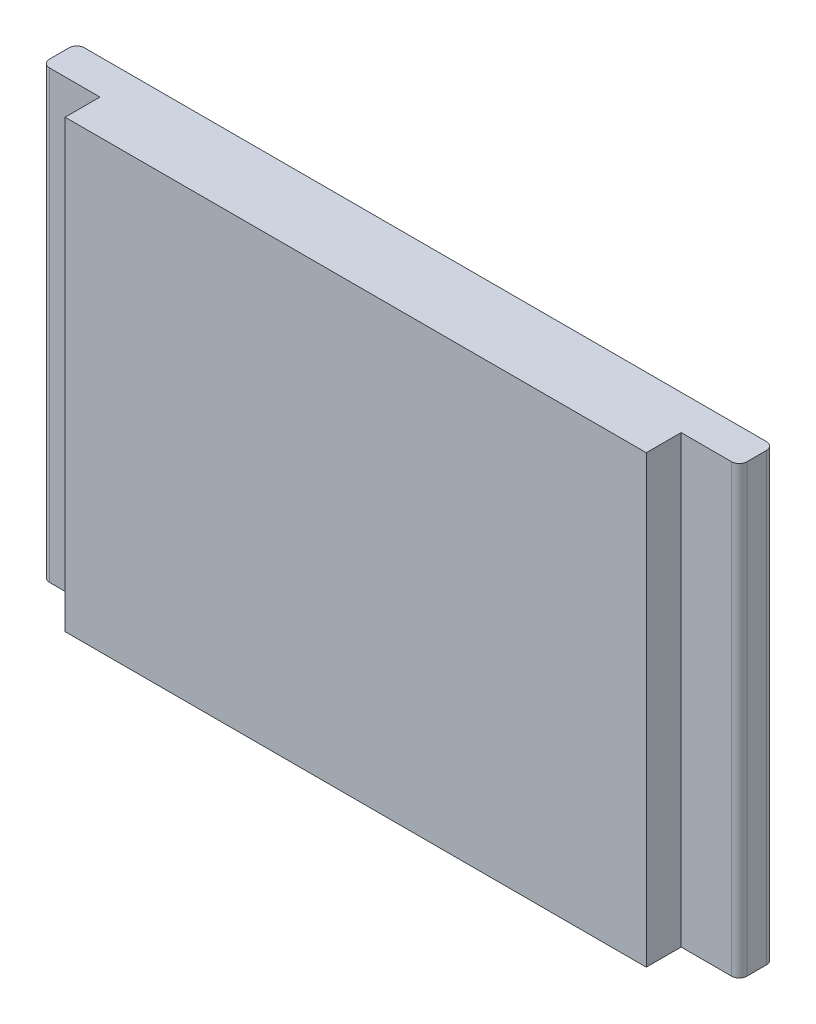
ISO-10303-21;
HEADER;
FILE_DESCRIPTION(('STEP AP214'),'2;1');
FILE_NAME('part.step','',(''),(''),'','','');
FILE_SCHEMA(('AUTOMOTIVE_DESIGN { 1 0 10303 214 1 1 1 1 }'));
ENDSEC;
DATA;
#1=APPLICATION_CONTEXT('core data for automotive mechanical design processes');
#2=APPLICATION_PROTOCOL_DEFINITION('international standard','automotive_design',2000,#1);
#3=PRODUCT_CONTEXT('',#1,'mechanical');
#4=PRODUCT('Part','Part','',(#3));
#5=PRODUCT_RELATED_PRODUCT_CATEGORY('part','',(#4));
#6=PRODUCT_DEFINITION_FORMATION('','',#4);
#7=PRODUCT_DEFINITION_CONTEXT('part definition',#1,'design');
#8=PRODUCT_DEFINITION('design','',#6,#7);
#9=PRODUCT_DEFINITION_SHAPE('','',#8);
#10=(LENGTH_UNIT() NAMED_UNIT(*) SI_UNIT(.MILLI.,.METRE.));
#11=(NAMED_UNIT(*) PLANE_ANGLE_UNIT() SI_UNIT($,.RADIAN.));
#12=(NAMED_UNIT(*) SI_UNIT($,.STERADIAN.) SOLID_ANGLE_UNIT());
#13=UNCERTAINTY_MEASURE_WITH_UNIT(LENGTH_MEASURE(1.E-05),#10,'distance_accuracy_value','');
#14=(GEOMETRIC_REPRESENTATION_CONTEXT(3) GLOBAL_UNCERTAINTY_ASSIGNED_CONTEXT((#13)) GLOBAL_UNIT_ASSIGNED_CONTEXT((#10,
#11,#12)) REPRESENTATION_CONTEXT('',''));
#15=CARTESIAN_POINT('',(0.,0.,0.));
#16=DIRECTION('',(0.,0.,1.));
#17=DIRECTION('',(1.,0.,0.));
#18=AXIS2_PLACEMENT_3D('',#15,#16,#17);
#19=CARTESIAN_POINT('',(-83.7886311209956,115.,-27.8081601870833));
#20=DIRECTION('',(1.,0.,0.));
#21=DIRECTION('',(0.,0.,-1.));
#22=AXIS2_PLACEMENT_3D('',#19,#20,#21);
#23=PLANE('',#22);
#24=DIRECTION('',(0.,0.,1.));
#25=VECTOR('',#24,1.);
#26=CARTESIAN_POINT('',(-83.7886311209956,0.,-27.8081601870833));
#27=LINE('',#26,#25);
#28=CARTESIAN_POINT('',(-83.7886311209956,0.,-27.8081601870833));
#29=VERTEX_POINT('',#28);
#30=CARTESIAN_POINT('',(-83.7886311209956,0.,-18.8081601870833));
#31=VERTEX_POINT('',#30);
#32=EDGE_CURVE('E179',#29,#31,#27,.T.);
#33=ORIENTED_EDGE('',*,*,#32,.T.);
#34=DIRECTION('',(0.,-1.,0.));
#35=VECTOR('',#34,1.);
#36=CARTESIAN_POINT('',(-83.7886311209956,115.,-18.8081601870833));
#37=LINE('',#36,#35);
#38=CARTESIAN_POINT('',(-83.7886311209956,115.,-18.8081601870833));
#39=VERTEX_POINT('',#38);
#40=EDGE_CURVE('E11',#39,#31,#37,.T.);
#41=ORIENTED_EDGE('',*,*,#40,.F.);
#42=DIRECTION('',(0.,0.,1.));
#43=VECTOR('',#42,1.);
#44=CARTESIAN_POINT('',(-83.7886311209956,115.,-27.8081601870833));
#45=LINE('',#44,#43);
#46=CARTESIAN_POINT('',(-83.7886311209956,115.,-27.8081601870833));
#47=VERTEX_POINT('',#46);
#48=EDGE_CURVE('E215',#47,#39,#45,.T.);
#49=ORIENTED_EDGE('',*,*,#48,.F.);
#50=DIRECTION('',(0.,-1.,0.));
#51=VECTOR('',#50,1.);
#52=CARTESIAN_POINT('',(-83.7886311209956,115.,-27.8081601870833));
#53=LINE('',#52,#51);
#54=EDGE_CURVE('E175',#47,#29,#53,.T.);
#55=ORIENTED_EDGE('',*,*,#54,.T.);
#56=EDGE_LOOP('',(#33,#41,#49,#55));
#57=FACE_BOUND('',#56,.T.);
#58=ADVANCED_FACE('F42',(#57),#23,.F.);
#59=CARTESIAN_POINT('',(-83.7886311209956,115.,-18.8081601870833));
#60=DIRECTION('',(0.,0.,-1.));
#61=DIRECTION('',(-1.,0.,0.));
#62=AXIS2_PLACEMENT_3D('',#59,#60,#61);
#63=PLANE('',#62);
#64=DIRECTION('',(1.,0.,0.));
#65=VECTOR('',#64,1.);
#66=CARTESIAN_POINT('',(-83.7886311209956,0.,-18.8081601870833));
#67=LINE('',#66,#65);
#68=CARTESIAN_POINT('',(66.2113688790044,0.,-18.8081601870833));
#69=VERTEX_POINT('',#68);
#70=EDGE_CURVE('E183',#31,#69,#67,.T.);
#71=ORIENTED_EDGE('',*,*,#70,.T.);
#72=DIRECTION('',(0.,-1.,0.));
#73=VECTOR('',#72,1.);
#74=CARTESIAN_POINT('',(66.2113688790044,115.,-18.8081601870833));
#75=LINE('',#74,#73);
#76=CARTESIAN_POINT('',(66.2113688790044,115.,-18.8081601870833));
#77=VERTEX_POINT('',#76);
#78=EDGE_CURVE('E50',#77,#69,#75,.T.);
#79=ORIENTED_EDGE('',*,*,#78,.F.);
#80=DIRECTION('',(1.,0.,0.));
#81=VECTOR('',#80,1.);
#82=CARTESIAN_POINT('',(-83.7886311209956,115.,-18.8081601870833));
#83=LINE('',#82,#81);
#84=EDGE_CURVE('E119',#39,#77,#83,.T.);
#85=ORIENTED_EDGE('',*,*,#84,.F.);
#86=ORIENTED_EDGE('',*,*,#40,.T.);
#87=EDGE_LOOP('',(#71,#79,#85,#86));
#88=FACE_BOUND('',#87,.T.);
#89=ADVANCED_FACE('F512',(#88),#63,.F.);
#90=CARTESIAN_POINT('',(66.2113688790044,115.,-18.8081601870833));
#91=DIRECTION('',(-1.,0.,0.));
#92=DIRECTION('',(0.,0.,1.));
#93=AXIS2_PLACEMENT_3D('',#90,#91,#92);
#94=PLANE('',#93);
#95=DIRECTION('',(0.,0.,-1.));
#96=VECTOR('',#95,1.);
#97=CARTESIAN_POINT('',(66.2113688790044,0.,-18.8081601870833));
#98=LINE('',#97,#96);
#99=CARTESIAN_POINT('',(66.2113688790044,0.,-27.8081601870833));
#100=VERTEX_POINT('',#99);
#101=EDGE_CURVE('E187',#69,#100,#98,.T.);
#102=ORIENTED_EDGE('',*,*,#101,.T.);
#103=DIRECTION('',(0.,-1.,0.));
#104=VECTOR('',#103,1.);
#105=CARTESIAN_POINT('',(66.2113688790044,115.,-27.8081601870833));
#106=LINE('',#105,#104);
#107=CARTESIAN_POINT('',(66.2113688790044,115.,-27.8081601870833));
#108=VERTEX_POINT('',#107);
#109=EDGE_CURVE('E242',#108,#100,#106,.T.);
#110=ORIENTED_EDGE('',*,*,#109,.F.);
#111=DIRECTION('',(0.,0.,-1.));
#112=VECTOR('',#111,1.);
#113=CARTESIAN_POINT('',(66.2113688790044,115.,-18.8081601870833));
#114=LINE('',#113,#112);
#115=EDGE_CURVE('E252',#77,#108,#114,.T.);
#116=ORIENTED_EDGE('',*,*,#115,.F.);
#117=ORIENTED_EDGE('',*,*,#78,.T.);
#118=EDGE_LOOP('',(#102,#110,#116,#117));
#119=FACE_BOUND('',#118,.T.);
#120=ADVANCED_FACE('F250',(#119),#94,.F.);
#121=CARTESIAN_POINT('',(66.2113688790044,115.,-27.8081601870833));
#122=DIRECTION('',(0.,0.,-1.));
#123=DIRECTION('',(-1.,0.,0.));
#124=AXIS2_PLACEMENT_3D('',#121,#122,#123);
#125=PLANE('',#124);
#126=DIRECTION('',(1.,0.,0.));
#127=VECTOR('',#126,1.);
#128=CARTESIAN_POINT('',(66.2113688790044,0.,-27.8081601870833));
#129=LINE('',#128,#127);
#130=CARTESIAN_POINT('',(79.2113688790043,0.,-27.8081601870833));
#131=VERTEX_POINT('',#130);
#132=EDGE_CURVE('E190',#100,#131,#129,.T.);
#133=ORIENTED_EDGE('',*,*,#132,.T.);
#134=DIRECTION('',(0.,-1.,0.));
#135=VECTOR('',#134,1.);
#136=CARTESIAN_POINT('',(79.2113688790043,115.,-27.8081601870833));
#137=LINE('',#136,#135);
#138=CARTESIAN_POINT('',(79.2113688790043,115.,-27.8081601870833));
#139=VERTEX_POINT('',#138);
#140=EDGE_CURVE('E238',#139,#131,#137,.T.);
#141=ORIENTED_EDGE('',*,*,#140,.F.);
#142=DIRECTION('',(1.,0.,0.));
#143=VECTOR('',#142,1.);
#144=CARTESIAN_POINT('',(66.2113688790044,115.,-27.8081601870833));
#145=LINE('',#144,#143);
#146=EDGE_CURVE('E271',#108,#139,#145,.T.);
#147=ORIENTED_EDGE('',*,*,#146,.F.);
#148=ORIENTED_EDGE('',*,*,#109,.T.);
#149=EDGE_LOOP('',(#133,#141,#147,#148));
#150=FACE_BOUND('',#149,.T.);
#151=ADVANCED_FACE('F261',(#150),#125,.F.);
#152=CARTESIAN_POINT('',(79.2113688790044,115.,-29.8081601870833));
#153=DIRECTION('',(0.,-1.,0.));
#154=DIRECTION('',(0.,0.,-1.));
#155=AXIS2_PLACEMENT_3D('',#152,#153,#154);
#156=CYLINDRICAL_SURFACE('',#155,2.);
#157=CARTESIAN_POINT('',(79.2113688790044,0.,-29.8081601870833));
#158=DIRECTION('',(0.,1.,0.));
#159=DIRECTION('',(0.,0.,1.));
#160=AXIS2_PLACEMENT_3D('',#157,#158,#159);
#161=CIRCLE('',#160,2.);
#162=CARTESIAN_POINT('',(81.2113688790044,0.,-29.8081601870833));
#163=VERTEX_POINT('',#162);
#164=EDGE_CURVE('E193',#131,#163,#161,.T.);
#165=ORIENTED_EDGE('',*,*,#164,.T.);
#166=DIRECTION('',(0.,-1.,0.));
#167=VECTOR('',#166,1.);
#168=CARTESIAN_POINT('',(81.2113688790044,115.,-29.8081601870833));
#169=LINE('',#168,#167);
#170=CARTESIAN_POINT('',(81.2113688790044,115.,-29.8081601870833));
#171=VERTEX_POINT('',#170);
#172=EDGE_CURVE('E234',#171,#163,#169,.T.);
#173=ORIENTED_EDGE('',*,*,#172,.F.);
#174=CARTESIAN_POINT('',(79.2113688790044,115.,-29.8081601870833));
#175=DIRECTION('',(0.,1.,0.));
#176=DIRECTION('',(0.,0.,1.));
#177=AXIS2_PLACEMENT_3D('',#174,#175,#176);
#178=CIRCLE('',#177,2.);
#179=EDGE_CURVE('E267',#139,#171,#178,.T.);
#180=ORIENTED_EDGE('',*,*,#179,.F.);
#181=ORIENTED_EDGE('',*,*,#140,.T.);
#182=EDGE_LOOP('',(#165,#173,#180,#181));
#183=FACE_BOUND('',#182,.T.);
#184=ADVANCED_FACE('F265',(#183),#156,.T.);
#185=CARTESIAN_POINT('',(81.2113688790044,115.,-29.8081601870833));
#186=DIRECTION('',(-1.,0.,0.));
#187=DIRECTION('',(0.,0.,1.));
#188=AXIS2_PLACEMENT_3D('',#185,#186,#187);
#189=PLANE('',#188);
#190=DIRECTION('',(0.,0.,-1.));
#191=VECTOR('',#190,1.);
#192=CARTESIAN_POINT('',(81.2113688790044,0.,-29.8081601870833));
#193=LINE('',#192,#191);
#194=CARTESIAN_POINT('',(81.2113688790044,0.,-34.8081601870833));
#195=VERTEX_POINT('',#194);
#196=EDGE_CURVE('E196',#163,#195,#193,.T.);
#197=ORIENTED_EDGE('',*,*,#196,.T.);
#198=DIRECTION('',(0.,-1.,0.));
#199=VECTOR('',#198,1.);
#200=CARTESIAN_POINT('',(81.2113688790044,115.,-34.8081601870833));
#201=LINE('',#200,#199);
#202=CARTESIAN_POINT('',(81.2113688790044,115.,-34.8081601870833));
#203=VERTEX_POINT('',#202);
#204=EDGE_CURVE('E230',#203,#195,#201,.T.);
#205=ORIENTED_EDGE('',*,*,#204,.F.);
#206=DIRECTION('',(0.,0.,-1.));
#207=VECTOR('',#206,1.);
#208=CARTESIAN_POINT('',(81.2113688790044,115.,-29.8081601870833));
#209=LINE('',#208,#207);
#210=EDGE_CURVE('E270',#171,#203,#209,.T.);
#211=ORIENTED_EDGE('',*,*,#210,.F.);
#212=ORIENTED_EDGE('',*,*,#172,.T.);
#213=EDGE_LOOP('',(#197,#205,#211,#212));
#214=FACE_BOUND('',#213,.T.);
#215=ADVANCED_FACE('F525',(#214),#189,.F.);
#216=CARTESIAN_POINT('',(79.2113688790044,115.,-34.8081601870833));
#217=DIRECTION('',(0.,-1.,0.));
#218=DIRECTION('',(0.,0.,-1.));
#219=AXIS2_PLACEMENT_3D('',#216,#217,#218);
#220=CYLINDRICAL_SURFACE('',#219,2.);
#221=CARTESIAN_POINT('',(79.2113688790044,0.,-34.8081601870833));
#222=DIRECTION('',(0.,1.,0.));
#223=DIRECTION('',(0.,0.,1.));
#224=AXIS2_PLACEMENT_3D('',#221,#222,#223);
#225=CIRCLE('',#224,2.);
#226=CARTESIAN_POINT('',(79.2113688790043,0.,-36.8081601870833));
#227=VERTEX_POINT('',#226);
#228=EDGE_CURVE('E199',#195,#227,#225,.T.);
#229=ORIENTED_EDGE('',*,*,#228,.T.);
#230=DIRECTION('',(0.,-1.,0.));
#231=VECTOR('',#230,1.);
#232=CARTESIAN_POINT('',(79.2113688790043,115.,-36.8081601870833));
#233=LINE('',#232,#231);
#234=CARTESIAN_POINT('',(79.2113688790043,115.,-36.8081601870833));
#235=VERTEX_POINT('',#234);
#236=EDGE_CURVE('E226',#235,#227,#233,.T.);
#237=ORIENTED_EDGE('',*,*,#236,.F.);
#238=CARTESIAN_POINT('',(79.2113688790044,115.,-34.8081601870833));
#239=DIRECTION('',(0.,1.,0.));
#240=DIRECTION('',(0.,0.,1.));
#241=AXIS2_PLACEMENT_3D('',#238,#239,#240);
#242=CIRCLE('',#241,2.);
#243=EDGE_CURVE('E275',#203,#235,#242,.T.);
#244=ORIENTED_EDGE('',*,*,#243,.F.);
#245=ORIENTED_EDGE('',*,*,#204,.T.);
#246=EDGE_LOOP('',(#229,#237,#244,#245));
#247=FACE_BOUND('',#246,.T.);
#248=ADVANCED_FACE('F528',(#247),#220,.T.);
#249=CARTESIAN_POINT('',(79.2113688790043,115.,-36.8081601870833));
#250=DIRECTION('',(0.,0.,1.));
#251=DIRECTION('',(1.,0.,0.));
#252=AXIS2_PLACEMENT_3D('',#249,#250,#251);
#253=PLANE('',#252);
#254=DIRECTION('',(0.510538754155434,0.859854743840736,0.));
#255=VECTOR('',#254,1.);
#256=CARTESIAN_POINT('',(-31.0554960786922,86.5331898341033,-36.8081601870833));
#257=LINE('',#256,#255);
#258=CARTESIAN_POINT('',(-31.0554960786922,86.5331898341033,-36.8081601870833));
#259=VERTEX_POINT('',#258);
#260=CARTESIAN_POINT('',(-27.4083371632074,92.6757732707092,-36.8081601870833));
#261=VERTEX_POINT('',#260);
#262=EDGE_CURVE('E376',#259,#261,#257,.T.);
#263=ORIENTED_EDGE('',*,*,#262,.F.);
#264=DIRECTION('',(-0.707106781186544,0.707106781186551,0.));
#265=VECTOR('',#264,1.);
#266=CARTESIAN_POINT('',(-27.4083371632074,82.8860309186185,-36.8081601870833));
#267=LINE('',#266,#265);
#268=CARTESIAN_POINT('',(-27.4083371632074,82.8860309186185,-36.8081601870833));
#269=VERTEX_POINT('',#268);
#270=EDGE_CURVE('E57',#269,#259,#267,.T.);
#271=ORIENTED_EDGE('',*,*,#270,.F.);
#272=DIRECTION('',(-1.,0.,0.));
#273=VECTOR('',#272,1.);
#274=CARTESIAN_POINT('',(-27.4083371632074,82.8860309186185,-36.8081601870833));
#275=LINE('',#274,#273);
#276=CARTESIAN_POINT('',(-3.41387061396539,82.8860309186185,-36.8081601870833));
#277=VERTEX_POINT('',#276);
#278=EDGE_CURVE('E343',#277,#269,#275,.T.);
#279=ORIENTED_EDGE('',*,*,#278,.F.);
#280=DIRECTION('',(0.707106781186551,0.707106781186544,0.));
#281=VECTOR('',#280,1.);
#282=CARTESIAN_POINT('',(-3.41387061396539,82.8860309186185,-36.8081601870833));
#283=LINE('',#282,#281);
#284=CARTESIAN_POINT('',(-20.1140193322379,66.1858822003461,-36.8081601870833));
#285=VERTEX_POINT('',#284);
#286=EDGE_CURVE('E348',#285,#277,#283,.T.);
#287=ORIENTED_EDGE('',*,*,#286,.F.);
#288=DIRECTION('',(-0.707106781186544,0.707106781186551,0.));
#289=VECTOR('',#288,1.);
#290=CARTESIAN_POINT('',(-20.1140193322379,66.1858822003461,-36.8081601870833));
#291=LINE('',#290,#289);
#292=CARTESIAN_POINT('',(-9.36449831817747,55.4363611862856,-36.8081601870833));
#293=VERTEX_POINT('',#292);
#294=EDGE_CURVE('E352',#293,#285,#291,.T.);
#295=ORIENTED_EDGE('',*,*,#294,.F.);
#296=DIRECTION('',(0.707106781186551,0.707106781186544,0.));
#297=VECTOR('',#296,1.);
#298=CARTESIAN_POINT('',(-9.36449831817747,55.4363611862856,-36.8081601870833));
#299=LINE('',#298,#297);
#300=CARTESIAN_POINT('',(-33.0710312688286,31.7298282356347,-36.8081601870833));
#301=VERTEX_POINT('',#300);
#302=EDGE_CURVE('E356',#301,#293,#299,.T.);
#303=ORIENTED_EDGE('',*,*,#302,.F.);
#304=DIRECTION('',(-0.83991717391604,-0.542714603600173,0.));
#305=VECTOR('',#304,1.);
#306=CARTESIAN_POINT('',(3.61772563428824,55.4363611862856,-36.8081601870833));
#307=LINE('',#306,#305);
#308=CARTESIAN_POINT('',(3.61772563428824,55.4363611862856,-36.8081601870833));
#309=VERTEX_POINT('',#308);
#310=EDGE_CURVE('E360',#309,#301,#307,.T.);
#311=ORIENTED_EDGE('',*,*,#310,.F.);
#312=DIRECTION('',(0.727505051384588,-0.686102324883037,0.));
#313=VECTOR('',#312,1.);
#314=CARTESIAN_POINT('',(-7.78047337199992,66.1858822003461,-36.8081601870833));
#315=LINE('',#314,#313);
#316=CARTESIAN_POINT('',(-7.78047337199992,66.1858822003461,-36.8081601870833));
#317=VERTEX_POINT('',#316);
#318=EDGE_CURVE('E364',#317,#309,#315,.T.);
#319=ORIENTED_EDGE('',*,*,#318,.F.);
#320=DIRECTION('',(-0.686102324883037,-0.727505051384587,0.));
#321=VECTOR('',#320,1.);
#322=CARTESIAN_POINT('',(18.4690828789434,94.0194633974666,-36.8081601870833));
#323=LINE('',#322,#321);
#324=CARTESIAN_POINT('',(18.4690828789434,94.0194633974666,-36.8081601870833));
#325=VERTEX_POINT('',#324);
#326=EDGE_CURVE('E368',#325,#317,#323,.T.);
#327=ORIENTED_EDGE('',*,*,#326,.F.);
#328=DIRECTION('',(0.999571361694161,0.0292761486688634,0.));
#329=VECTOR('',#328,1.);
#330=CARTESIAN_POINT('',(-27.4083371632074,92.6757732707092,-36.8081601870833));
#331=LINE('',#330,#329);
#332=EDGE_CURVE('E372',#261,#325,#331,.T.);
#333=ORIENTED_EDGE('',*,*,#332,.F.);
#334=EDGE_LOOP('',(#263,#271,#279,#287,#295,#303,#311,#319,#327,#333));
#335=FACE_BOUND('',#334,.T.);
#336=DIRECTION('',(-1.,0.,0.));
#337=VECTOR('',#336,1.);
#338=CARTESIAN_POINT('',(79.2113688790043,0.,-36.8081601870833));
#339=LINE('',#338,#337);
#340=CARTESIAN_POINT('',(-96.7886311209956,0.,-36.8081601870833));
#341=VERTEX_POINT('',#340);
#342=EDGE_CURVE('E202',#227,#341,#339,.T.);
#343=ORIENTED_EDGE('',*,*,#342,.T.);
#344=DIRECTION('',(0.,-1.,0.));
#345=VECTOR('',#344,1.);
#346=CARTESIAN_POINT('',(-96.7886311209956,115.,-36.8081601870833));
#347=LINE('',#346,#345);
#348=CARTESIAN_POINT('',(-96.7886311209956,115.,-36.8081601870833));
#349=VERTEX_POINT('',#348);
#350=EDGE_CURVE('E222',#349,#341,#347,.T.);
#351=ORIENTED_EDGE('',*,*,#350,.F.);
#352=DIRECTION('',(-1.,0.,0.));
#353=VECTOR('',#352,1.);
#354=CARTESIAN_POINT('',(79.2113688790043,115.,-36.8081601870833));
#355=LINE('',#354,#353);
#356=EDGE_CURVE('E282',#235,#349,#355,.T.);
#357=ORIENTED_EDGE('',*,*,#356,.F.);
#358=ORIENTED_EDGE('',*,*,#236,.T.);
#359=EDGE_LOOP('',(#343,#351,#357,#358));
#360=FACE_BOUND('',#359,.T.);
#361=ADVANCED_FACE('F290',(#335,#360),#253,.F.);
#362=CARTESIAN_POINT('',(-96.7886311209956,115.,-34.8081601870833));
#363=DIRECTION('',(0.,-1.,0.));
#364=DIRECTION('',(0.,0.,-1.));
#365=AXIS2_PLACEMENT_3D('',#362,#363,#364);
#366=CYLINDRICAL_SURFACE('',#365,2.);
#367=CARTESIAN_POINT('',(-96.7886311209956,0.,-34.8081601870833));
#368=DIRECTION('',(0.,1.,0.));
#369=DIRECTION('',(0.,0.,-1.));
#370=AXIS2_PLACEMENT_3D('',#367,#368,#369);
#371=CIRCLE('',#370,2.);
#372=CARTESIAN_POINT('',(-98.7886311209956,0.,-34.8081601870833));
#373=VERTEX_POINT('',#372);
#374=EDGE_CURVE('E205',#341,#373,#371,.T.);
#375=ORIENTED_EDGE('',*,*,#374,.T.);
#376=DIRECTION('',(0.,-1.,0.));
#377=VECTOR('',#376,1.);
#378=CARTESIAN_POINT('',(-98.7886311209956,115.,-34.8081601870833));
#379=LINE('',#378,#377);
#380=CARTESIAN_POINT('',(-98.7886311209956,115.,-34.8081601870833));
#381=VERTEX_POINT('',#380);
#382=EDGE_CURVE('E168',#381,#373,#379,.T.);
#383=ORIENTED_EDGE('',*,*,#382,.F.);
#384=CARTESIAN_POINT('',(-96.7886311209956,115.,-34.8081601870833));
#385=DIRECTION('',(0.,1.,0.));
#386=DIRECTION('',(0.,0.,-1.));
#387=AXIS2_PLACEMENT_3D('',#384,#385,#386);
#388=CIRCLE('',#387,2.);
#389=EDGE_CURVE('E154',#349,#381,#388,.T.);
#390=ORIENTED_EDGE('',*,*,#389,.F.);
#391=ORIENTED_EDGE('',*,*,#350,.T.);
#392=EDGE_LOOP('',(#375,#383,#390,#391));
#393=FACE_BOUND('',#392,.T.);
#394=ADVANCED_FACE('F294',(#393),#366,.T.);
#395=CARTESIAN_POINT('',(-98.7886311209956,115.,-34.8081601870833));
#396=DIRECTION('',(1.,0.,0.));
#397=DIRECTION('',(0.,0.,-1.));
#398=AXIS2_PLACEMENT_3D('',#395,#396,#397);
#399=PLANE('',#398);
#400=DIRECTION('',(0.,0.,1.));
#401=VECTOR('',#400,1.);
#402=CARTESIAN_POINT('',(-98.7886311209956,0.,-34.8081601870833));
#403=LINE('',#402,#401);
#404=CARTESIAN_POINT('',(-98.7886311209956,0.,-29.8081601870833));
#405=VERTEX_POINT('',#404);
#406=EDGE_CURVE('E164',#373,#405,#403,.T.);
#407=ORIENTED_EDGE('',*,*,#406,.T.);
#408=DIRECTION('',(0.,-1.,0.));
#409=VECTOR('',#408,1.);
#410=CARTESIAN_POINT('',(-98.7886311209956,115.,-29.8081601870833));
#411=LINE('',#410,#409);
#412=CARTESIAN_POINT('',(-98.7886311209956,115.,-29.8081601870833));
#413=VERTEX_POINT('',#412);
#414=EDGE_CURVE('E161',#413,#405,#411,.T.);
#415=ORIENTED_EDGE('',*,*,#414,.F.);
#416=DIRECTION('',(0.,0.,1.));
#417=VECTOR('',#416,1.);
#418=CARTESIAN_POINT('',(-98.7886311209956,115.,-34.8081601870833));
#419=LINE('',#418,#417);
#420=EDGE_CURVE('E147',#381,#413,#419,.T.);
#421=ORIENTED_EDGE('',*,*,#420,.F.);
#422=ORIENTED_EDGE('',*,*,#382,.T.);
#423=EDGE_LOOP('',(#407,#415,#421,#422));
#424=FACE_BOUND('',#423,.T.);
#425=ADVANCED_FACE('F162',(#424),#399,.F.);
#426=CARTESIAN_POINT('',(-96.7886311209956,115.,-29.8081601870833));
#427=DIRECTION('',(0.,-1.,0.));
#428=DIRECTION('',(0.,0.,-1.));
#429=AXIS2_PLACEMENT_3D('',#426,#427,#428);
#430=CYLINDRICAL_SURFACE('',#429,2.);
#431=CARTESIAN_POINT('',(-96.7886311209956,0.,-29.8081601870833));
#432=DIRECTION('',(0.,1.,0.));
#433=DIRECTION('',(0.,0.,1.));
#434=AXIS2_PLACEMENT_3D('',#431,#432,#433);
#435=CIRCLE('',#434,2.);
#436=CARTESIAN_POINT('',(-96.7886311209956,0.,-27.8081601870833));
#437=VERTEX_POINT('',#436);
#438=EDGE_CURVE('E210',#405,#437,#435,.T.);
#439=ORIENTED_EDGE('',*,*,#438,.T.);
#440=DIRECTION('',(0.,-1.,0.));
#441=VECTOR('',#440,1.);
#442=CARTESIAN_POINT('',(-96.7886311209956,115.,-27.8081601870833));
#443=LINE('',#442,#441);
#444=CARTESIAN_POINT('',(-96.7886311209956,115.,-27.8081601870833));
#445=VERTEX_POINT('',#444);
#446=EDGE_CURVE('E169',#445,#437,#443,.T.);
#447=ORIENTED_EDGE('',*,*,#446,.F.);
#448=CARTESIAN_POINT('',(-96.7886311209956,115.,-29.8081601870833));
#449=DIRECTION('',(0.,1.,0.));
#450=DIRECTION('',(0.,0.,1.));
#451=AXIS2_PLACEMENT_3D('',#448,#449,#450);
#452=CIRCLE('',#451,2.);
#453=EDGE_CURVE('E151',#413,#445,#452,.T.);
#454=ORIENTED_EDGE('',*,*,#453,.F.);
#455=ORIENTED_EDGE('',*,*,#414,.T.);
#456=EDGE_LOOP('',(#439,#447,#454,#455));
#457=FACE_BOUND('',#456,.T.);
#458=ADVANCED_FACE('F171',(#457),#430,.T.);
#459=CARTESIAN_POINT('',(-96.7886311209956,115.,-27.8081601870833));
#460=DIRECTION('',(0.,0.,-1.));
#461=DIRECTION('',(-1.,0.,0.));
#462=AXIS2_PLACEMENT_3D('',#459,#460,#461);
#463=PLANE('',#462);
#464=DIRECTION('',(1.,0.,0.));
#465=VECTOR('',#464,1.);
#466=CARTESIAN_POINT('',(-96.7886311209956,0.,-27.8081601870833));
#467=LINE('',#466,#465);
#468=EDGE_CURVE('E111',#437,#29,#467,.T.);
#469=ORIENTED_EDGE('',*,*,#468,.T.);
#470=ORIENTED_EDGE('',*,*,#54,.F.);
#471=DIRECTION('',(1.,0.,0.));
#472=VECTOR('',#471,1.);
#473=CARTESIAN_POINT('',(-96.7886311209956,115.,-27.8081601870833));
#474=LINE('',#473,#472);
#475=EDGE_CURVE('E66',#445,#47,#474,.T.);
#476=ORIENTED_EDGE('',*,*,#475,.F.);
#477=ORIENTED_EDGE('',*,*,#446,.T.);
#478=EDGE_LOOP('',(#469,#470,#476,#477));
#479=FACE_BOUND('',#478,.T.);
#480=ADVANCED_FACE('F295',(#479),#463,.F.);
#481=CARTESIAN_POINT('',(79.2113688790044,115.,-29.8081601870833));
#482=DIRECTION('',(0.,1.,0.));
#483=DIRECTION('',(0.,0.,1.));
#484=AXIS2_PLACEMENT_3D('',#481,#482,#483);
#485=PLANE('',#484);
#486=ORIENTED_EDGE('',*,*,#48,.T.);
#487=ORIENTED_EDGE('',*,*,#84,.T.);
#488=ORIENTED_EDGE('',*,*,#115,.T.);
#489=ORIENTED_EDGE('',*,*,#146,.T.);
#490=ORIENTED_EDGE('',*,*,#179,.T.);
#491=ORIENTED_EDGE('',*,*,#210,.T.);
#492=ORIENTED_EDGE('',*,*,#243,.T.);
#493=ORIENTED_EDGE('',*,*,#356,.T.);
#494=ORIENTED_EDGE('',*,*,#389,.T.);
#495=ORIENTED_EDGE('',*,*,#420,.T.);
#496=ORIENTED_EDGE('',*,*,#453,.T.);
#497=ORIENTED_EDGE('',*,*,#475,.T.);
#498=EDGE_LOOP('',(#486,#487,#488,#489,#490,#491,#492,#493,#494,#495,#496,#497));
#499=FACE_BOUND('',#498,.T.);
#500=ADVANCED_FACE('F149',(#499),#485,.T.);
#501=CARTESIAN_POINT('',(79.2113688790044,0.,-29.8081601870833));
#502=DIRECTION('',(0.,1.,0.));
#503=DIRECTION('',(0.,0.,1.));
#504=AXIS2_PLACEMENT_3D('',#501,#502,#503);
#505=PLANE('',#504);
#506=ORIENTED_EDGE('',*,*,#32,.F.);
#507=ORIENTED_EDGE('',*,*,#468,.F.);
#508=ORIENTED_EDGE('',*,*,#438,.F.);
#509=ORIENTED_EDGE('',*,*,#406,.F.);
#510=ORIENTED_EDGE('',*,*,#374,.F.);
#511=ORIENTED_EDGE('',*,*,#342,.F.);
#512=ORIENTED_EDGE('',*,*,#228,.F.);
#513=ORIENTED_EDGE('',*,*,#196,.F.);
#514=ORIENTED_EDGE('',*,*,#164,.F.);
#515=ORIENTED_EDGE('',*,*,#132,.F.);
#516=ORIENTED_EDGE('',*,*,#101,.F.);
#517=ORIENTED_EDGE('',*,*,#70,.F.);
#518=EDGE_LOOP('',(#506,#507,#508,#509,#510,#511,#512,#513,#514,#515,#516,#517));
#519=FACE_BOUND('',#518,.T.);
#520=ADVANCED_FACE('F256',(#519),#505,.F.);
#521=CARTESIAN_POINT('',(-27.4083371632074,82.8860309186185,-34.8081601870833));
#522=DIRECTION('',(-0.707106781186551,-0.707106781186544,0.));
#523=DIRECTION('',(0.707106781186544,-0.707106781186551,0.));
#524=AXIS2_PLACEMENT_3D('',#521,#522,#523);
#525=PLANE('',#524);
#526=ORIENTED_EDGE('',*,*,#270,.T.);
#527=DIRECTION('',(0.,0.,-1.));
#528=VECTOR('',#527,1.);
#529=CARTESIAN_POINT('',(-31.0554960786922,86.5331898341033,-34.8081601870833));
#530=LINE('',#529,#528);
#531=CARTESIAN_POINT('',(-31.0554960786922,86.5331898341033,-34.8081601870833));
#532=VERTEX_POINT('',#531);
#533=EDGE_CURVE('E304',#532,#259,#530,.T.);
#534=ORIENTED_EDGE('',*,*,#533,.F.);
#535=DIRECTION('',(-0.707106781186544,0.707106781186551,0.));
#536=VECTOR('',#535,1.);
#537=CARTESIAN_POINT('',(-27.4083371632074,82.8860309186185,-34.8081601870833));
#538=LINE('',#537,#536);
#539=CARTESIAN_POINT('',(-27.4083371632074,82.8860309186185,-34.8081601870833));
#540=VERTEX_POINT('',#539);
#541=EDGE_CURVE('E347',#540,#532,#538,.T.);
#542=ORIENTED_EDGE('',*,*,#541,.F.);
#543=DIRECTION('',(0.,0.,-1.));
#544=VECTOR('',#543,1.);
#545=CARTESIAN_POINT('',(-27.4083371632074,82.8860309186185,-34.8081601870833));
#546=LINE('',#545,#544);
#547=EDGE_CURVE('E184',#540,#269,#546,.T.);
#548=ORIENTED_EDGE('',*,*,#547,.T.);
#549=EDGE_LOOP('',(#526,#534,#542,#548));
#550=FACE_BOUND('',#549,.T.);
#551=ADVANCED_FACE('F427',(#550),#525,.F.);
#552=CARTESIAN_POINT('',(-27.4083371632074,82.8860309186185,-34.8081601870833));
#553=DIRECTION('',(0.,-1.,0.));
#554=DIRECTION('',(0.,0.,-1.));
#555=AXIS2_PLACEMENT_3D('',#552,#553,#554);
#556=PLANE('',#555);
#557=ORIENTED_EDGE('',*,*,#278,.T.);
#558=ORIENTED_EDGE('',*,*,#547,.F.);
#559=DIRECTION('',(-1.,0.,0.));
#560=VECTOR('',#559,1.);
#561=CARTESIAN_POINT('',(-27.4083371632074,82.8860309186185,-34.8081601870833));
#562=LINE('',#561,#560);
#563=CARTESIAN_POINT('',(-3.41387061396539,82.8860309186185,-34.8081601870833));
#564=VERTEX_POINT('',#563);
#565=EDGE_CURVE('E309',#564,#540,#562,.T.);
#566=ORIENTED_EDGE('',*,*,#565,.F.);
#567=DIRECTION('',(0.,0.,-1.));
#568=VECTOR('',#567,1.);
#569=CARTESIAN_POINT('',(-3.41387061396539,82.8860309186185,-34.8081601870833));
#570=LINE('',#569,#568);
#571=EDGE_CURVE('E337',#564,#277,#570,.T.);
#572=ORIENTED_EDGE('',*,*,#571,.T.);
#573=EDGE_LOOP('',(#557,#558,#566,#572));
#574=FACE_BOUND('',#573,.T.);
#575=ADVANCED_FACE('F451',(#574),#556,.F.);
#576=CARTESIAN_POINT('',(-3.41387061396539,82.8860309186185,-34.8081601870833));
#577=DIRECTION('',(-0.707106781186544,0.707106781186551,0.));
#578=DIRECTION('',(-0.707106781186551,-0.707106781186544,0.));
#579=AXIS2_PLACEMENT_3D('',#576,#577,#578);
#580=PLANE('',#579);
#581=ORIENTED_EDGE('',*,*,#286,.T.);
#582=ORIENTED_EDGE('',*,*,#571,.F.);
#583=DIRECTION('',(0.707106781186551,0.707106781186544,0.));
#584=VECTOR('',#583,1.);
#585=CARTESIAN_POINT('',(-3.41387061396539,82.8860309186185,-34.8081601870833));
#586=LINE('',#585,#584);
#587=CARTESIAN_POINT('',(-20.1140193322379,66.1858822003461,-34.8081601870833));
#588=VERTEX_POINT('',#587);
#589=EDGE_CURVE('E385',#588,#564,#586,.T.);
#590=ORIENTED_EDGE('',*,*,#589,.F.);
#591=DIRECTION('',(0.,0.,-1.));
#592=VECTOR('',#591,1.);
#593=CARTESIAN_POINT('',(-20.1140193322379,66.1858822003461,-34.8081601870833));
#594=LINE('',#593,#592);
#595=EDGE_CURVE('E333',#588,#285,#594,.T.);
#596=ORIENTED_EDGE('',*,*,#595,.T.);
#597=EDGE_LOOP('',(#581,#582,#590,#596));
#598=FACE_BOUND('',#597,.T.);
#599=ADVANCED_FACE('F456',(#598),#580,.F.);
#600=CARTESIAN_POINT('',(-20.1140193322379,66.1858822003461,-34.8081601870833));
#601=DIRECTION('',(-0.707106781186551,-0.707106781186544,0.));
#602=DIRECTION('',(0.707106781186544,-0.707106781186551,0.));
#603=AXIS2_PLACEMENT_3D('',#600,#601,#602);
#604=PLANE('',#603);
#605=ORIENTED_EDGE('',*,*,#294,.T.);
#606=ORIENTED_EDGE('',*,*,#595,.F.);
#607=DIRECTION('',(-0.707106781186544,0.707106781186551,0.));
#608=VECTOR('',#607,1.);
#609=CARTESIAN_POINT('',(-20.1140193322379,66.1858822003461,-34.8081601870833));
#610=LINE('',#609,#608);
#611=CARTESIAN_POINT('',(-9.36449831817747,55.4363611862856,-34.8081601870833));
#612=VERTEX_POINT('',#611);
#613=EDGE_CURVE('E389',#612,#588,#610,.T.);
#614=ORIENTED_EDGE('',*,*,#613,.F.);
#615=DIRECTION('',(0.,0.,-1.));
#616=VECTOR('',#615,1.);
#617=CARTESIAN_POINT('',(-9.36449831817747,55.4363611862856,-34.8081601870833));
#618=LINE('',#617,#616);
#619=EDGE_CURVE('E329',#612,#293,#618,.T.);
#620=ORIENTED_EDGE('',*,*,#619,.T.);
#621=EDGE_LOOP('',(#605,#606,#614,#620));
#622=FACE_BOUND('',#621,.T.);
#623=ADVANCED_FACE('F488',(#622),#604,.F.);
#624=CARTESIAN_POINT('',(-9.36449831817747,55.4363611862856,-34.8081601870833));
#625=DIRECTION('',(-0.707106781186544,0.707106781186551,0.));
#626=DIRECTION('',(-0.707106781186551,-0.707106781186544,0.));
#627=AXIS2_PLACEMENT_3D('',#624,#625,#626);
#628=PLANE('',#627);
#629=ORIENTED_EDGE('',*,*,#302,.T.);
#630=ORIENTED_EDGE('',*,*,#619,.F.);
#631=DIRECTION('',(0.707106781186551,0.707106781186544,0.));
#632=VECTOR('',#631,1.);
#633=CARTESIAN_POINT('',(-9.36449831817747,55.4363611862856,-34.8081601870833));
#634=LINE('',#633,#632);
#635=CARTESIAN_POINT('',(-33.0710312688286,31.7298282356347,-34.8081601870833));
#636=VERTEX_POINT('',#635);
#637=EDGE_CURVE('E393',#636,#612,#634,.T.);
#638=ORIENTED_EDGE('',*,*,#637,.F.);
#639=DIRECTION('',(0.,0.,-1.));
#640=VECTOR('',#639,1.);
#641=CARTESIAN_POINT('',(-33.0710312688286,31.7298282356347,-34.8081601870833));
#642=LINE('',#641,#640);
#643=EDGE_CURVE('E325',#636,#301,#642,.T.);
#644=ORIENTED_EDGE('',*,*,#643,.T.);
#645=EDGE_LOOP('',(#629,#630,#638,#644));
#646=FACE_BOUND('',#645,.T.);
#647=ADVANCED_FACE('F492',(#646),#628,.F.);
#648=CARTESIAN_POINT('',(3.61772563428824,55.4363611862856,-34.8081601870833));
#649=DIRECTION('',(0.542714603600173,-0.83991717391604,0.));
#650=DIRECTION('',(0.83991717391604,0.542714603600173,0.));
#651=AXIS2_PLACEMENT_3D('',#648,#649,#650);
#652=PLANE('',#651);
#653=ORIENTED_EDGE('',*,*,#310,.T.);
#654=ORIENTED_EDGE('',*,*,#643,.F.);
#655=DIRECTION('',(-0.83991717391604,-0.542714603600173,0.));
#656=VECTOR('',#655,1.);
#657=CARTESIAN_POINT('',(3.61772563428824,55.4363611862856,-34.8081601870833));
#658=LINE('',#657,#656);
#659=CARTESIAN_POINT('',(3.61772563428824,55.4363611862856,-34.8081601870833));
#660=VERTEX_POINT('',#659);
#661=EDGE_CURVE('E397',#660,#636,#658,.T.);
#662=ORIENTED_EDGE('',*,*,#661,.F.);
#663=DIRECTION('',(0.,0.,-1.));
#664=VECTOR('',#663,1.);
#665=CARTESIAN_POINT('',(3.61772563428824,55.4363611862856,-34.8081601870833));
#666=LINE('',#665,#664);
#667=EDGE_CURVE('E321',#660,#309,#666,.T.);
#668=ORIENTED_EDGE('',*,*,#667,.T.);
#669=EDGE_LOOP('',(#653,#654,#662,#668));
#670=FACE_BOUND('',#669,.T.);
#671=ADVANCED_FACE('F497',(#670),#652,.F.);
#672=CARTESIAN_POINT('',(-7.78047337199992,66.1858822003461,-34.8081601870833));
#673=DIRECTION('',(0.686102324883037,0.727505051384588,0.));
#674=DIRECTION('',(-0.727505051384588,0.686102324883037,0.));
#675=AXIS2_PLACEMENT_3D('',#672,#673,#674);
#676=PLANE('',#675);
#677=ORIENTED_EDGE('',*,*,#318,.T.);
#678=ORIENTED_EDGE('',*,*,#667,.F.);
#679=DIRECTION('',(0.727505051384588,-0.686102324883037,0.));
#680=VECTOR('',#679,1.);
#681=CARTESIAN_POINT('',(-7.78047337199992,66.1858822003461,-34.8081601870833));
#682=LINE('',#681,#680);
#683=CARTESIAN_POINT('',(-7.78047337199992,66.1858822003461,-34.8081601870833));
#684=VERTEX_POINT('',#683);
#685=EDGE_CURVE('E401',#684,#660,#682,.T.);
#686=ORIENTED_EDGE('',*,*,#685,.F.);
#687=DIRECTION('',(0.,0.,-1.));
#688=VECTOR('',#687,1.);
#689=CARTESIAN_POINT('',(-7.78047337199992,66.1858822003461,-34.8081601870833));
#690=LINE('',#689,#688);
#691=EDGE_CURVE('E317',#684,#317,#690,.T.);
#692=ORIENTED_EDGE('',*,*,#691,.T.);
#693=EDGE_LOOP('',(#677,#678,#686,#692));
#694=FACE_BOUND('',#693,.T.);
#695=ADVANCED_FACE('F500',(#694),#676,.F.);
#696=CARTESIAN_POINT('',(18.4690828789434,94.0194633974666,-34.8081601870833));
#697=DIRECTION('',(0.727505051384587,-0.686102324883037,0.));
#698=DIRECTION('',(0.686102324883037,0.727505051384588,0.));
#699=AXIS2_PLACEMENT_3D('',#696,#697,#698);
#700=PLANE('',#699);
#701=ORIENTED_EDGE('',*,*,#326,.T.);
#702=ORIENTED_EDGE('',*,*,#691,.F.);
#703=DIRECTION('',(-0.686102324883037,-0.727505051384587,0.));
#704=VECTOR('',#703,1.);
#705=CARTESIAN_POINT('',(18.4690828789434,94.0194633974666,-34.8081601870833));
#706=LINE('',#705,#704);
#707=CARTESIAN_POINT('',(18.4690828789434,94.0194633974666,-34.8081601870833));
#708=VERTEX_POINT('',#707);
#709=EDGE_CURVE('E405',#708,#684,#706,.T.);
#710=ORIENTED_EDGE('',*,*,#709,.F.);
#711=DIRECTION('',(0.,0.,-1.));
#712=VECTOR('',#711,1.);
#713=CARTESIAN_POINT('',(18.4690828789434,94.0194633974666,-34.8081601870833));
#714=LINE('',#713,#712);
#715=EDGE_CURVE('E313',#708,#325,#714,.T.);
#716=ORIENTED_EDGE('',*,*,#715,.T.);
#717=EDGE_LOOP('',(#701,#702,#710,#716));
#718=FACE_BOUND('',#717,.T.);
#719=ADVANCED_FACE('F502',(#718),#700,.F.);
#720=CARTESIAN_POINT('',(-27.4083371632074,92.6757732707092,-34.8081601870833));
#721=DIRECTION('',(-0.0292761486688634,0.999571361694161,0.));
#722=DIRECTION('',(-0.999571361694161,-0.0292761486688634,0.));
#723=AXIS2_PLACEMENT_3D('',#720,#721,#722);
#724=PLANE('',#723);
#725=ORIENTED_EDGE('',*,*,#332,.T.);
#726=ORIENTED_EDGE('',*,*,#715,.F.);
#727=DIRECTION('',(0.999571361694161,0.0292761486688634,0.));
#728=VECTOR('',#727,1.);
#729=CARTESIAN_POINT('',(-27.4083371632074,92.6757732707092,-34.8081601870833));
#730=LINE('',#729,#728);
#731=CARTESIAN_POINT('',(-27.4083371632074,92.6757732707092,-34.8081601870833));
#732=VERTEX_POINT('',#731);
#733=EDGE_CURVE('E409',#732,#708,#730,.T.);
#734=ORIENTED_EDGE('',*,*,#733,.F.);
#735=DIRECTION('',(0.,0.,-1.));
#736=VECTOR('',#735,1.);
#737=CARTESIAN_POINT('',(-27.4083371632074,92.6757732707092,-34.8081601870833));
#738=LINE('',#737,#736);
#739=EDGE_CURVE('E308',#732,#261,#738,.T.);
#740=ORIENTED_EDGE('',*,*,#739,.T.);
#741=EDGE_LOOP('',(#725,#726,#734,#740));
#742=FACE_BOUND('',#741,.T.);
#743=ADVANCED_FACE('F471',(#742),#724,.F.);
#744=CARTESIAN_POINT('',(-31.0554960786922,86.5331898341033,-34.8081601870833));
#745=DIRECTION('',(-0.859854743840736,0.510538754155434,0.));
#746=DIRECTION('',(-0.510538754155434,-0.859854743840736,0.));
#747=AXIS2_PLACEMENT_3D('',#744,#745,#746);
#748=PLANE('',#747);
#749=ORIENTED_EDGE('',*,*,#262,.T.);
#750=ORIENTED_EDGE('',*,*,#739,.F.);
#751=DIRECTION('',(0.510538754155434,0.859854743840736,0.));
#752=VECTOR('',#751,1.);
#753=CARTESIAN_POINT('',(-31.0554960786922,86.5331898341033,-34.8081601870833));
#754=LINE('',#753,#752);
#755=EDGE_CURVE('E413',#532,#732,#754,.T.);
#756=ORIENTED_EDGE('',*,*,#755,.F.);
#757=ORIENTED_EDGE('',*,*,#533,.T.);
#758=EDGE_LOOP('',(#749,#750,#756,#757));
#759=FACE_BOUND('',#758,.T.);
#760=ADVANCED_FACE('F465',(#759),#748,.F.);
#761=CARTESIAN_POINT('',(0.,0.,-34.8081601870833));
#762=DIRECTION('',(0.,0.,1.));
#763=DIRECTION('',(1.,0.,0.));
#764=AXIS2_PLACEMENT_3D('',#761,#762,#763);
#765=PLANE('',#764);
#766=ORIENTED_EDGE('',*,*,#541,.T.);
#767=ORIENTED_EDGE('',*,*,#755,.T.);
#768=ORIENTED_EDGE('',*,*,#733,.T.);
#769=ORIENTED_EDGE('',*,*,#709,.T.);
#770=ORIENTED_EDGE('',*,*,#685,.T.);
#771=ORIENTED_EDGE('',*,*,#661,.T.);
#772=ORIENTED_EDGE('',*,*,#637,.T.);
#773=ORIENTED_EDGE('',*,*,#613,.T.);
#774=ORIENTED_EDGE('',*,*,#589,.T.);
#775=ORIENTED_EDGE('',*,*,#565,.T.);
#776=EDGE_LOOP('',(#766,#767,#768,#769,#770,#771,#772,#773,#774,#775));
#777=FACE_BOUND('',#776,.T.);
#778=ADVANCED_FACE('F422',(#777),#765,.F.);
#779=CLOSED_SHELL('',(#58,#89,#120,#151,#184,#215,#248,#361,#394,#425,#458,#480,#500,#520,#551,
#575,#599,#623,#647,#671,#695,#719,#743,#760,#778));
#780=MANIFOLD_SOLID_BREP('B2',#779);
#781=ADVANCED_BREP_SHAPE_REPRESENTATION('',(#18,#780),#14);
#782=SHAPE_DEFINITION_REPRESENTATION(#9,#781);
ENDSEC;
END-ISO-10303-21;
